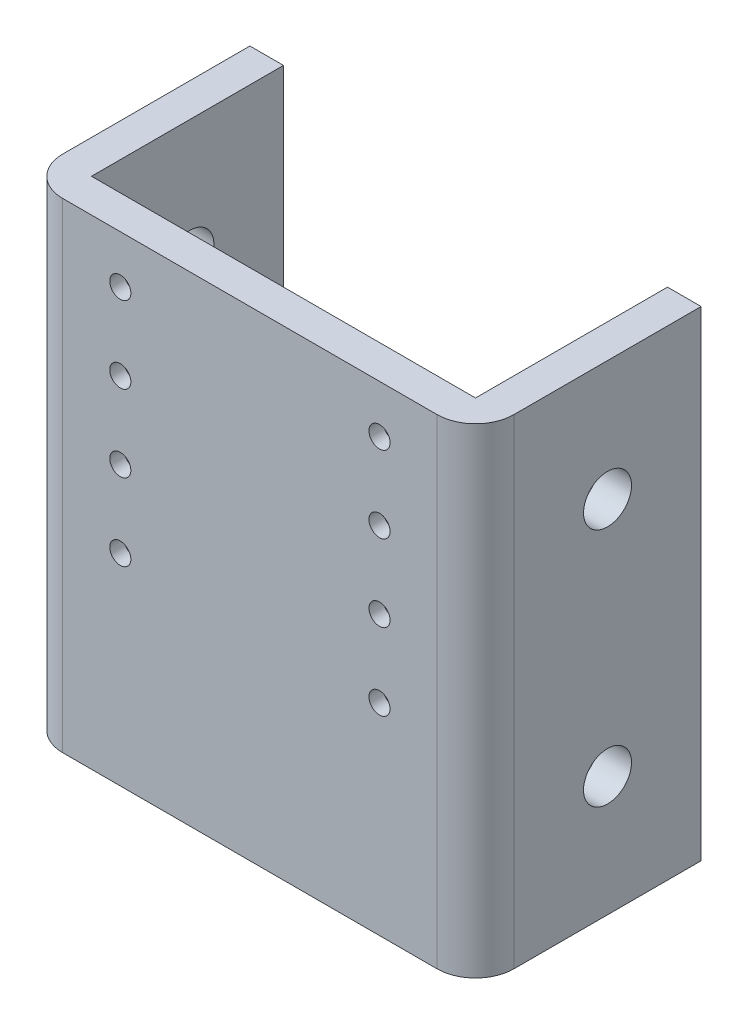
ISO-10303-21;
HEADER;
FILE_DESCRIPTION(('STEP AP214'),'2;1');
FILE_NAME('part.step','',(''),(''),'','','');
FILE_SCHEMA(('AUTOMOTIVE_DESIGN { 1 0 10303 214 1 1 1 1 }'));
ENDSEC;
DATA;
#1=APPLICATION_CONTEXT('core data for automotive mechanical design processes');
#2=APPLICATION_PROTOCOL_DEFINITION('international standard','automotive_design',2000,#1);
#3=PRODUCT_CONTEXT('',#1,'mechanical');
#4=PRODUCT('Part','Part','',(#3));
#5=PRODUCT_RELATED_PRODUCT_CATEGORY('part','',(#4));
#6=PRODUCT_DEFINITION_FORMATION('','',#4);
#7=PRODUCT_DEFINITION_CONTEXT('part definition',#1,'design');
#8=PRODUCT_DEFINITION('design','',#6,#7);
#9=PRODUCT_DEFINITION_SHAPE('','',#8);
#10=(LENGTH_UNIT() NAMED_UNIT(*) SI_UNIT(.MILLI.,.METRE.));
#11=(NAMED_UNIT(*) PLANE_ANGLE_UNIT() SI_UNIT($,.RADIAN.));
#12=(NAMED_UNIT(*) SI_UNIT($,.STERADIAN.) SOLID_ANGLE_UNIT());
#13=UNCERTAINTY_MEASURE_WITH_UNIT(LENGTH_MEASURE(1.E-05),#10,'distance_accuracy_value','');
#14=(GEOMETRIC_REPRESENTATION_CONTEXT(3) GLOBAL_UNCERTAINTY_ASSIGNED_CONTEXT((#13)) GLOBAL_UNIT_ASSIGNED_CONTEXT((#10,
#11,#12)) REPRESENTATION_CONTEXT('',''));
#15=CARTESIAN_POINT('',(0.,0.,0.));
#16=DIRECTION('',(0.,0.,1.));
#17=DIRECTION('',(1.,0.,0.));
#18=AXIS2_PLACEMENT_3D('',#15,#16,#17);
#19=CARTESIAN_POINT('',(-13.5,20.,-1.5));
#20=DIRECTION('',(0.,0.,1.));
#21=DIRECTION('',(1.,0.,0.));
#22=AXIS2_PLACEMENT_3D('',#19,#20,#21);
#23=CYLINDRICAL_SURFACE('',#22,1.1);
#24=CARTESIAN_POINT('',(-13.5,20.,3.5));
#25=DIRECTION('',(0.,0.,1.));
#26=DIRECTION('',(1.,0.,0.));
#27=AXIS2_PLACEMENT_3D('',#24,#25,#26);
#28=CIRCLE('',#27,1.1);
#29=CARTESIAN_POINT('',(-12.4,20.,3.5));
#30=VERTEX_POINT('',#29);
#31=EDGE_CURVE('E203',#30,#30,#28,.T.);
#32=ORIENTED_EDGE('',*,*,#31,.T.);
#33=EDGE_LOOP('',(#32));
#34=FACE_BOUND('',#33,.T.);
#35=CARTESIAN_POINT('',(-13.5,20.,2.));
#36=DIRECTION('',(0.,0.,-1.));
#37=DIRECTION('',(-1.,0.,0.));
#38=AXIS2_PLACEMENT_3D('',#35,#36,#37);
#39=CIRCLE('',#38,1.1);
#40=CARTESIAN_POINT('',(-14.6,20.,2.));
#41=VERTEX_POINT('',#40);
#42=EDGE_CURVE('E155',#41,#41,#39,.F.);
#43=ORIENTED_EDGE('',*,*,#42,.F.);
#44=EDGE_LOOP('',(#43));
#45=FACE_BOUND('',#44,.T.);
#46=ADVANCED_FACE('F41',(#34,#45),#23,.F.);
#47=CARTESIAN_POINT('',(13.5,20.,-1.5));
#48=DIRECTION('',(0.,0.,1.));
#49=DIRECTION('',(1.,0.,0.));
#50=AXIS2_PLACEMENT_3D('',#47,#48,#49);
#51=CYLINDRICAL_SURFACE('',#50,1.1);
#52=CARTESIAN_POINT('',(13.5,20.,3.5));
#53=DIRECTION('',(0.,0.,1.));
#54=DIRECTION('',(1.,0.,0.));
#55=AXIS2_PLACEMENT_3D('',#52,#53,#54);
#56=CIRCLE('',#55,1.1);
#57=CARTESIAN_POINT('',(14.6,20.,3.5));
#58=VERTEX_POINT('',#57);
#59=EDGE_CURVE('E199',#58,#58,#56,.T.);
#60=ORIENTED_EDGE('',*,*,#59,.T.);
#61=EDGE_LOOP('',(#60));
#62=FACE_BOUND('',#61,.T.);
#63=CARTESIAN_POINT('',(13.5,20.,2.));
#64=DIRECTION('',(0.,0.,-1.));
#65=DIRECTION('',(-1.,0.,0.));
#66=AXIS2_PLACEMENT_3D('',#63,#64,#65);
#67=CIRCLE('',#66,1.1);
#68=CARTESIAN_POINT('',(12.4,20.,2.));
#69=VERTEX_POINT('',#68);
#70=EDGE_CURVE('E289',#69,#69,#67,.F.);
#71=ORIENTED_EDGE('',*,*,#70,.F.);
#72=EDGE_LOOP('',(#71));
#73=FACE_BOUND('',#72,.T.);
#74=ADVANCED_FACE('F440',(#62,#73),#51,.F.);
#75=CARTESIAN_POINT('',(13.5000000000001,12.,-1.5));
#76=DIRECTION('',(0.,0.,1.));
#77=DIRECTION('',(1.,0.,0.));
#78=AXIS2_PLACEMENT_3D('',#75,#76,#77);
#79=CYLINDRICAL_SURFACE('',#78,1.1);
#80=CARTESIAN_POINT('',(13.5000000000001,12.,3.5));
#81=DIRECTION('',(0.,0.,1.));
#82=DIRECTION('',(1.,0.,0.));
#83=AXIS2_PLACEMENT_3D('',#80,#81,#82);
#84=CIRCLE('',#83,1.1);
#85=CARTESIAN_POINT('',(14.6000000000001,12.,3.5));
#86=VERTEX_POINT('',#85);
#87=EDGE_CURVE('E204',#86,#86,#84,.T.);
#88=ORIENTED_EDGE('',*,*,#87,.T.);
#89=EDGE_LOOP('',(#88));
#90=FACE_BOUND('',#89,.T.);
#91=CARTESIAN_POINT('',(13.5000000000001,12.,2.));
#92=DIRECTION('',(0.,0.,-1.));
#93=DIRECTION('',(-1.,0.,0.));
#94=AXIS2_PLACEMENT_3D('',#91,#92,#93);
#95=CIRCLE('',#94,1.1);
#96=CARTESIAN_POINT('',(12.4000000000001,12.,2.));
#97=VERTEX_POINT('',#96);
#98=EDGE_CURVE('E285',#97,#97,#95,.F.);
#99=ORIENTED_EDGE('',*,*,#98,.F.);
#100=EDGE_LOOP('',(#99));
#101=FACE_BOUND('',#100,.T.);
#102=ADVANCED_FACE('F446',(#90,#101),#79,.F.);
#103=CARTESIAN_POINT('',(13.5000000000002,4.,-1.5));
#104=DIRECTION('',(0.,0.,1.));
#105=DIRECTION('',(1.,0.,0.));
#106=AXIS2_PLACEMENT_3D('',#103,#104,#105);
#107=CYLINDRICAL_SURFACE('',#106,1.1);
#108=CARTESIAN_POINT('',(13.5000000000002,4.,3.5));
#109=DIRECTION('',(0.,0.,1.));
#110=DIRECTION('',(1.,0.,0.));
#111=AXIS2_PLACEMENT_3D('',#108,#109,#110);
#112=CIRCLE('',#111,1.1);
#113=CARTESIAN_POINT('',(14.6000000000002,4.,3.5));
#114=VERTEX_POINT('',#113);
#115=EDGE_CURVE('E208',#114,#114,#112,.T.);
#116=ORIENTED_EDGE('',*,*,#115,.T.);
#117=EDGE_LOOP('',(#116));
#118=FACE_BOUND('',#117,.T.);
#119=CARTESIAN_POINT('',(13.5000000000002,4.,2.));
#120=DIRECTION('',(0.,0.,-1.));
#121=DIRECTION('',(-1.,0.,0.));
#122=AXIS2_PLACEMENT_3D('',#119,#120,#121);
#123=CIRCLE('',#122,1.1);
#124=CARTESIAN_POINT('',(12.4000000000002,4.,2.));
#125=VERTEX_POINT('',#124);
#126=EDGE_CURVE('E281',#125,#125,#123,.F.);
#127=ORIENTED_EDGE('',*,*,#126,.F.);
#128=EDGE_LOOP('',(#127));
#129=FACE_BOUND('',#128,.T.);
#130=ADVANCED_FACE('F656',(#118,#129),#107,.F.);
#131=CARTESIAN_POINT('',(13.5000000000003,-4.,-1.5));
#132=DIRECTION('',(0.,0.,1.));
#133=DIRECTION('',(1.,0.,0.));
#134=AXIS2_PLACEMENT_3D('',#131,#132,#133);
#135=CYLINDRICAL_SURFACE('',#134,1.1);
#136=CARTESIAN_POINT('',(13.5000000000003,-4.,3.5));
#137=DIRECTION('',(0.,0.,1.));
#138=DIRECTION('',(1.,0.,0.));
#139=AXIS2_PLACEMENT_3D('',#136,#137,#138);
#140=CIRCLE('',#139,1.1);
#141=CARTESIAN_POINT('',(14.6000000000003,-4.,3.5));
#142=VERTEX_POINT('',#141);
#143=EDGE_CURVE('E212',#142,#142,#140,.T.);
#144=ORIENTED_EDGE('',*,*,#143,.T.);
#145=EDGE_LOOP('',(#144));
#146=FACE_BOUND('',#145,.T.);
#147=CARTESIAN_POINT('',(13.5000000000003,-4.,2.));
#148=DIRECTION('',(0.,0.,-1.));
#149=DIRECTION('',(-1.,0.,0.));
#150=AXIS2_PLACEMENT_3D('',#147,#148,#149);
#151=CIRCLE('',#150,1.1);
#152=CARTESIAN_POINT('',(12.4000000000002,-4.,2.));
#153=VERTEX_POINT('',#152);
#154=EDGE_CURVE('E277',#153,#153,#151,.F.);
#155=ORIENTED_EDGE('',*,*,#154,.F.);
#156=EDGE_LOOP('',(#155));
#157=FACE_BOUND('',#156,.T.);
#158=ADVANCED_FACE('F666',(#146,#157),#135,.F.);
#159=CARTESIAN_POINT('',(-13.4999999999999,12.,-1.5));
#160=DIRECTION('',(0.,0.,1.));
#161=DIRECTION('',(1.,0.,0.));
#162=AXIS2_PLACEMENT_3D('',#159,#160,#161);
#163=CYLINDRICAL_SURFACE('',#162,1.1);
#164=CARTESIAN_POINT('',(-13.4999999999999,12.,3.5));
#165=DIRECTION('',(0.,0.,1.));
#166=DIRECTION('',(1.,0.,0.));
#167=AXIS2_PLACEMENT_3D('',#164,#165,#166);
#168=CIRCLE('',#167,1.1);
#169=CARTESIAN_POINT('',(-12.3999999999999,12.,3.5));
#170=VERTEX_POINT('',#169);
#171=EDGE_CURVE('E216',#170,#170,#168,.T.);
#172=ORIENTED_EDGE('',*,*,#171,.T.);
#173=EDGE_LOOP('',(#172));
#174=FACE_BOUND('',#173,.T.);
#175=CARTESIAN_POINT('',(-13.4999999999999,12.,2.));
#176=DIRECTION('',(0.,0.,-1.));
#177=DIRECTION('',(-1.,0.,0.));
#178=AXIS2_PLACEMENT_3D('',#175,#176,#177);
#179=CIRCLE('',#178,1.1);
#180=CARTESIAN_POINT('',(-14.5999999999999,12.,2.));
#181=VERTEX_POINT('',#180);
#182=EDGE_CURVE('E273',#181,#181,#179,.F.);
#183=ORIENTED_EDGE('',*,*,#182,.F.);
#184=EDGE_LOOP('',(#183));
#185=FACE_BOUND('',#184,.T.);
#186=ADVANCED_FACE('F676',(#174,#185),#163,.F.);
#187=CARTESIAN_POINT('',(-13.4999999999998,4.,-1.5));
#188=DIRECTION('',(0.,0.,1.));
#189=DIRECTION('',(1.,0.,0.));
#190=AXIS2_PLACEMENT_3D('',#187,#188,#189);
#191=CYLINDRICAL_SURFACE('',#190,1.1);
#192=CARTESIAN_POINT('',(-13.4999999999998,4.,3.5));
#193=DIRECTION('',(0.,0.,1.));
#194=DIRECTION('',(1.,0.,0.));
#195=AXIS2_PLACEMENT_3D('',#192,#193,#194);
#196=CIRCLE('',#195,1.1);
#197=CARTESIAN_POINT('',(-12.3999999999998,4.,3.5));
#198=VERTEX_POINT('',#197);
#199=EDGE_CURVE('E220',#198,#198,#196,.T.);
#200=ORIENTED_EDGE('',*,*,#199,.T.);
#201=EDGE_LOOP('',(#200));
#202=FACE_BOUND('',#201,.T.);
#203=CARTESIAN_POINT('',(-13.4999999999998,4.,2.));
#204=DIRECTION('',(0.,0.,-1.));
#205=DIRECTION('',(-1.,0.,0.));
#206=AXIS2_PLACEMENT_3D('',#203,#204,#205);
#207=CIRCLE('',#206,1.1);
#208=CARTESIAN_POINT('',(-14.5999999999998,4.,2.));
#209=VERTEX_POINT('',#208);
#210=EDGE_CURVE('E268',#209,#209,#207,.F.);
#211=ORIENTED_EDGE('',*,*,#210,.F.);
#212=EDGE_LOOP('',(#211));
#213=FACE_BOUND('',#212,.T.);
#214=ADVANCED_FACE('F686',(#202,#213),#191,.F.);
#215=CARTESIAN_POINT('',(-13.4999999999997,-4.,-1.5));
#216=DIRECTION('',(0.,0.,1.));
#217=DIRECTION('',(1.,0.,0.));
#218=AXIS2_PLACEMENT_3D('',#215,#216,#217);
#219=CYLINDRICAL_SURFACE('',#218,1.1);
#220=CARTESIAN_POINT('',(-13.4999999999997,-4.,3.5));
#221=DIRECTION('',(0.,0.,1.));
#222=DIRECTION('',(1.,0.,0.));
#223=AXIS2_PLACEMENT_3D('',#220,#221,#222);
#224=CIRCLE('',#223,1.1);
#225=CARTESIAN_POINT('',(-12.3999999999997,-4.,3.5));
#226=VERTEX_POINT('',#225);
#227=EDGE_CURVE('E192',#226,#226,#224,.T.);
#228=ORIENTED_EDGE('',*,*,#227,.T.);
#229=EDGE_LOOP('',(#228));
#230=FACE_BOUND('',#229,.T.);
#231=CARTESIAN_POINT('',(-13.4999999999997,-4.,2.));
#232=DIRECTION('',(0.,0.,-1.));
#233=DIRECTION('',(-1.,0.,0.));
#234=AXIS2_PLACEMENT_3D('',#231,#232,#233);
#235=CIRCLE('',#234,1.1);
#236=CARTESIAN_POINT('',(-14.5999999999998,-4.,2.));
#237=VERTEX_POINT('',#236);
#238=EDGE_CURVE('E264',#237,#237,#235,.F.);
#239=ORIENTED_EDGE('',*,*,#238,.F.);
#240=EDGE_LOOP('',(#239));
#241=FACE_BOUND('',#240,.T.);
#242=ADVANCED_FACE('F452',(#230,#241),#219,.F.);
#243=CARTESIAN_POINT('',(-18.,25.,3.5));
#244=DIRECTION('',(0.,-1.,0.));
#245=DIRECTION('',(0.,0.,-1.));
#246=AXIS2_PLACEMENT_3D('',#243,#244,#245);
#247=PLANE('',#246);
#248=DIRECTION('',(0.,0.,1.));
#249=VECTOR('',#248,1.);
#250=CARTESIAN_POINT('',(-23.5,25.,0.));
#251=LINE('',#250,#249);
#252=CARTESIAN_POINT('',(-23.5,25.,-20.));
#253=VERTEX_POINT('',#252);
#254=CARTESIAN_POINT('',(-23.5,25.,-0.5));
#255=VERTEX_POINT('',#254);
#256=EDGE_CURVE('E162',#253,#255,#251,.T.);
#257=ORIENTED_EDGE('',*,*,#256,.T.);
#258=CARTESIAN_POINT('',(-19.5,25.,-0.5));
#259=DIRECTION('',(0.,-1.,0.));
#260=DIRECTION('',(0.,0.,-1.));
#261=AXIS2_PLACEMENT_3D('',#258,#259,#260);
#262=CIRCLE('',#261,4.);
#263=CARTESIAN_POINT('',(-19.5,25.,3.5));
#264=VERTEX_POINT('',#263);
#265=EDGE_CURVE('E250',#255,#264,#262,.F.);
#266=ORIENTED_EDGE('',*,*,#265,.T.);
#267=DIRECTION('',(-1.,0.,0.));
#268=VECTOR('',#267,1.);
#269=CARTESIAN_POINT('',(-18.,25.,3.5));
#270=LINE('',#269,#268);
#271=CARTESIAN_POINT('',(19.5,25.,3.5));
#272=VERTEX_POINT('',#271);
#273=EDGE_CURVE('E231',#272,#264,#270,.T.);
#274=ORIENTED_EDGE('',*,*,#273,.F.);
#275=CARTESIAN_POINT('',(19.5,25.,-0.5));
#276=DIRECTION('',(0.,-1.,0.));
#277=DIRECTION('',(0.,0.,-1.));
#278=AXIS2_PLACEMENT_3D('',#275,#276,#277);
#279=CIRCLE('',#278,4.);
#280=CARTESIAN_POINT('',(23.5,25.,-0.5));
#281=VERTEX_POINT('',#280);
#282=EDGE_CURVE('E247',#272,#281,#279,.F.);
#283=ORIENTED_EDGE('',*,*,#282,.T.);
#284=DIRECTION('',(0.,0.,1.));
#285=VECTOR('',#284,1.);
#286=CARTESIAN_POINT('',(23.5,25.,0.));
#287=LINE('',#286,#285);
#288=CARTESIAN_POINT('',(23.5,25.,-20.));
#289=VERTEX_POINT('',#288);
#290=EDGE_CURVE('E152',#289,#281,#287,.T.);
#291=ORIENTED_EDGE('',*,*,#290,.F.);
#292=DIRECTION('',(1.,0.,0.));
#293=VECTOR('',#292,1.);
#294=CARTESIAN_POINT('',(0.,25.,-20.));
#295=LINE('',#294,#293);
#296=CARTESIAN_POINT('',(20.,25.,-20.));
#297=VERTEX_POINT('',#296);
#298=EDGE_CURVE('E135',#297,#289,#295,.T.);
#299=ORIENTED_EDGE('',*,*,#298,.F.);
#300=DIRECTION('',(0.,0.,-1.));
#301=VECTOR('',#300,1.);
#302=CARTESIAN_POINT('',(20.,25.,0.));
#303=LINE('',#302,#301);
#304=CARTESIAN_POINT('',(20.,25.,0.));
#305=VERTEX_POINT('',#304);
#306=EDGE_CURVE('E142',#305,#297,#303,.T.);
#307=ORIENTED_EDGE('',*,*,#306,.F.);
#308=DIRECTION('',(-1.,0.,0.));
#309=VECTOR('',#308,1.);
#310=CARTESIAN_POINT('',(-18.,25.,0.));
#311=LINE('',#310,#309);
#312=CARTESIAN_POINT('',(-20.,25.,0.));
#313=VERTEX_POINT('',#312);
#314=EDGE_CURVE('E230',#305,#313,#311,.T.);
#315=ORIENTED_EDGE('',*,*,#314,.T.);
#316=DIRECTION('',(0.,0.,-1.));
#317=VECTOR('',#316,1.);
#318=CARTESIAN_POINT('',(-20.,25.,0.));
#319=LINE('',#318,#317);
#320=CARTESIAN_POINT('',(-20.,25.,-20.));
#321=VERTEX_POINT('',#320);
#322=EDGE_CURVE('E182',#313,#321,#319,.T.);
#323=ORIENTED_EDGE('',*,*,#322,.T.);
#324=DIRECTION('',(-1.,0.,0.));
#325=VECTOR('',#324,1.);
#326=CARTESIAN_POINT('',(0.,25.,-20.));
#327=LINE('',#326,#325);
#328=EDGE_CURVE('E170',#321,#253,#327,.T.);
#329=ORIENTED_EDGE('',*,*,#328,.T.);
#330=EDGE_LOOP('',(#257,#266,#274,#283,#291,#299,#307,#315,#323,#329));
#331=FACE_BOUND('',#330,.T.);
#332=ADVANCED_FACE('F406',(#331),#247,.F.);
#333=CARTESIAN_POINT('',(-18.,-25.,3.5));
#334=DIRECTION('',(0.,1.,0.));
#335=DIRECTION('',(0.,0.,1.));
#336=AXIS2_PLACEMENT_3D('',#333,#334,#335);
#337=PLANE('',#336);
#338=DIRECTION('',(1.,0.,0.));
#339=VECTOR('',#338,1.);
#340=CARTESIAN_POINT('',(-18.,-25.,3.5));
#341=LINE('',#340,#339);
#342=CARTESIAN_POINT('',(-19.5,-25.,3.5));
#343=VERTEX_POINT('',#342);
#344=CARTESIAN_POINT('',(19.5,-25.,3.5));
#345=VERTEX_POINT('',#344);
#346=EDGE_CURVE('E235',#343,#345,#341,.T.);
#347=ORIENTED_EDGE('',*,*,#346,.F.);
#348=CARTESIAN_POINT('',(-19.5,-25.,-0.5));
#349=DIRECTION('',(0.,1.,0.));
#350=DIRECTION('',(0.,0.,1.));
#351=AXIS2_PLACEMENT_3D('',#348,#349,#350);
#352=CIRCLE('',#351,4.);
#353=CARTESIAN_POINT('',(-23.5,-25.,-0.5));
#354=VERTEX_POINT('',#353);
#355=EDGE_CURVE('E51',#343,#354,#352,.F.);
#356=ORIENTED_EDGE('',*,*,#355,.T.);
#357=DIRECTION('',(0.,0.,1.));
#358=VECTOR('',#357,1.);
#359=CARTESIAN_POINT('',(-23.5,-25.,0.));
#360=LINE('',#359,#358);
#361=CARTESIAN_POINT('',(-23.5,-25.,-20.));
#362=VERTEX_POINT('',#361);
#363=EDGE_CURVE('E165',#362,#354,#360,.T.);
#364=ORIENTED_EDGE('',*,*,#363,.F.);
#365=DIRECTION('',(-1.,0.,0.));
#366=VECTOR('',#365,1.);
#367=CARTESIAN_POINT('',(0.,-25.,-20.));
#368=LINE('',#367,#366);
#369=CARTESIAN_POINT('',(-20.,-25.,-20.));
#370=VERTEX_POINT('',#369);
#371=EDGE_CURVE('E174',#370,#362,#368,.T.);
#372=ORIENTED_EDGE('',*,*,#371,.F.);
#373=DIRECTION('',(0.,0.,-1.));
#374=VECTOR('',#373,1.);
#375=CARTESIAN_POINT('',(-20.,-25.,0.));
#376=LINE('',#375,#374);
#377=CARTESIAN_POINT('',(-20.,-25.,0.));
#378=VERTEX_POINT('',#377);
#379=EDGE_CURVE('E169',#378,#370,#376,.T.);
#380=ORIENTED_EDGE('',*,*,#379,.F.);
#381=DIRECTION('',(1.,0.,0.));
#382=VECTOR('',#381,1.);
#383=CARTESIAN_POINT('',(-18.,-25.,0.));
#384=LINE('',#383,#382);
#385=CARTESIAN_POINT('',(20.,-25.,0.));
#386=VERTEX_POINT('',#385);
#387=EDGE_CURVE('E236',#378,#386,#384,.T.);
#388=ORIENTED_EDGE('',*,*,#387,.T.);
#389=DIRECTION('',(0.,0.,-1.));
#390=VECTOR('',#389,1.);
#391=CARTESIAN_POINT('',(20.,-25.,0.));
#392=LINE('',#391,#390);
#393=CARTESIAN_POINT('',(20.,-25.,-20.));
#394=VERTEX_POINT('',#393);
#395=EDGE_CURVE('E125',#386,#394,#392,.T.);
#396=ORIENTED_EDGE('',*,*,#395,.T.);
#397=DIRECTION('',(1.,0.,0.));
#398=VECTOR('',#397,1.);
#399=CARTESIAN_POINT('',(0.,-25.,-20.));
#400=LINE('',#399,#398);
#401=CARTESIAN_POINT('',(23.5,-25.,-20.));
#402=VERTEX_POINT('',#401);
#403=EDGE_CURVE('E120',#394,#402,#400,.T.);
#404=ORIENTED_EDGE('',*,*,#403,.T.);
#405=DIRECTION('',(0.,0.,1.));
#406=VECTOR('',#405,1.);
#407=CARTESIAN_POINT('',(23.5,-25.,0.));
#408=LINE('',#407,#406);
#409=CARTESIAN_POINT('',(23.5,-25.,-0.5));
#410=VERTEX_POINT('',#409);
#411=EDGE_CURVE('E123',#402,#410,#408,.T.);
#412=ORIENTED_EDGE('',*,*,#411,.T.);
#413=CARTESIAN_POINT('',(19.5,-25.,-0.5));
#414=DIRECTION('',(0.,1.,0.));
#415=DIRECTION('',(0.,0.,1.));
#416=AXIS2_PLACEMENT_3D('',#413,#414,#415);
#417=CIRCLE('',#416,4.);
#418=EDGE_CURVE('E64',#410,#345,#417,.F.);
#419=ORIENTED_EDGE('',*,*,#418,.T.);
#420=EDGE_LOOP('',(#347,#356,#364,#372,#380,#388,#396,#404,#412,#419));
#421=FACE_BOUND('',#420,.T.);
#422=ADVANCED_FACE('F122',(#421),#337,.F.);
#423=CARTESIAN_POINT('',(0.,0.,3.5));
#424=DIRECTION('',(0.,0.,-1.));
#425=DIRECTION('',(-1.,0.,0.));
#426=AXIS2_PLACEMENT_3D('',#423,#424,#425);
#427=PLANE('',#426);
#428=ORIENTED_EDGE('',*,*,#227,.F.);
#429=EDGE_LOOP('',(#428));
#430=FACE_BOUND('',#429,.T.);
#431=ORIENTED_EDGE('',*,*,#199,.F.);
#432=EDGE_LOOP('',(#431));
#433=FACE_BOUND('',#432,.T.);
#434=ORIENTED_EDGE('',*,*,#171,.F.);
#435=EDGE_LOOP('',(#434));
#436=FACE_BOUND('',#435,.T.);
#437=ORIENTED_EDGE('',*,*,#143,.F.);
#438=EDGE_LOOP('',(#437));
#439=FACE_BOUND('',#438,.T.);
#440=ORIENTED_EDGE('',*,*,#115,.F.);
#441=EDGE_LOOP('',(#440));
#442=FACE_BOUND('',#441,.T.);
#443=ORIENTED_EDGE('',*,*,#87,.F.);
#444=EDGE_LOOP('',(#443));
#445=FACE_BOUND('',#444,.T.);
#446=ORIENTED_EDGE('',*,*,#59,.F.);
#447=EDGE_LOOP('',(#446));
#448=FACE_BOUND('',#447,.T.);
#449=ORIENTED_EDGE('',*,*,#31,.F.);
#450=EDGE_LOOP('',(#449));
#451=FACE_BOUND('',#450,.T.);
#452=ORIENTED_EDGE('',*,*,#273,.T.);
#453=DIRECTION('',(0.,1.,0.));
#454=VECTOR('',#453,1.);
#455=CARTESIAN_POINT('',(-19.5,-25.,3.5));
#456=LINE('',#455,#454);
#457=EDGE_CURVE('E257',#264,#343,#456,.F.);
#458=ORIENTED_EDGE('',*,*,#457,.T.);
#459=ORIENTED_EDGE('',*,*,#346,.T.);
#460=DIRECTION('',(0.,1.,0.));
#461=VECTOR('',#460,1.);
#462=CARTESIAN_POINT('',(19.5,0.,3.5));
#463=LINE('',#462,#461);
#464=EDGE_CURVE('E253',#345,#272,#463,.T.);
#465=ORIENTED_EDGE('',*,*,#464,.T.);
#466=EDGE_LOOP('',(#452,#458,#459,#465));
#467=FACE_BOUND('',#466,.T.);
#468=ADVANCED_FACE('F396',(#430,#433,#436,#439,#442,#445,#448,#451,#467),#427,.F.);
#469=CARTESIAN_POINT('',(0.,0.,0.));
#470=DIRECTION('',(0.,0.,-1.));
#471=DIRECTION('',(-1.,0.,0.));
#472=AXIS2_PLACEMENT_3D('',#469,#470,#471);
#473=PLANE('',#472);
#474=CARTESIAN_POINT('',(13.4999999999997,-4.,0.));
#475=DIRECTION('',(0.,0.,-1.));
#476=DIRECTION('',(-1.,0.,0.));
#477=AXIS2_PLACEMENT_3D('',#474,#475,#476);
#478=CIRCLE('',#477,2.25);
#479=CARTESIAN_POINT('',(11.2499999999997,-4.,0.));
#480=VERTEX_POINT('',#479);
#481=EDGE_CURVE('E327',#480,#480,#478,.T.);
#482=ORIENTED_EDGE('',*,*,#481,.F.);
#483=EDGE_LOOP('',(#482));
#484=FACE_BOUND('',#483,.T.);
#485=CARTESIAN_POINT('',(13.4999999999998,4.,0.));
#486=DIRECTION('',(0.,0.,-1.));
#487=DIRECTION('',(-1.,0.,0.));
#488=AXIS2_PLACEMENT_3D('',#485,#486,#487);
#489=CIRCLE('',#488,2.25);
#490=CARTESIAN_POINT('',(11.2499999999998,4.,0.));
#491=VERTEX_POINT('',#490);
#492=EDGE_CURVE('E372',#491,#491,#489,.T.);
#493=ORIENTED_EDGE('',*,*,#492,.F.);
#494=EDGE_LOOP('',(#493));
#495=FACE_BOUND('',#494,.T.);
#496=CARTESIAN_POINT('',(13.4999999999999,12.,0.));
#497=DIRECTION('',(0.,0.,-1.));
#498=DIRECTION('',(-1.,0.,0.));
#499=AXIS2_PLACEMENT_3D('',#496,#497,#498);
#500=CIRCLE('',#499,2.25);
#501=CARTESIAN_POINT('',(11.2499999999999,12.,0.));
#502=VERTEX_POINT('',#501);
#503=EDGE_CURVE('E364',#502,#502,#500,.T.);
#504=ORIENTED_EDGE('',*,*,#503,.F.);
#505=EDGE_LOOP('',(#504));
#506=FACE_BOUND('',#505,.T.);
#507=CARTESIAN_POINT('',(-13.5000000000003,-4.,0.));
#508=DIRECTION('',(0.,0.,-1.));
#509=DIRECTION('',(-1.,0.,0.));
#510=AXIS2_PLACEMENT_3D('',#507,#508,#509);
#511=CIRCLE('',#510,2.25);
#512=CARTESIAN_POINT('',(-15.7500000000003,-4.,0.));
#513=VERTEX_POINT('',#512);
#514=EDGE_CURVE('E356',#513,#513,#511,.T.);
#515=ORIENTED_EDGE('',*,*,#514,.F.);
#516=EDGE_LOOP('',(#515));
#517=FACE_BOUND('',#516,.T.);
#518=CARTESIAN_POINT('',(-13.5000000000002,4.,0.));
#519=DIRECTION('',(0.,0.,-1.));
#520=DIRECTION('',(-1.,0.,0.));
#521=AXIS2_PLACEMENT_3D('',#518,#519,#520);
#522=CIRCLE('',#521,2.25);
#523=CARTESIAN_POINT('',(-15.7500000000002,4.,0.));
#524=VERTEX_POINT('',#523);
#525=EDGE_CURVE('E348',#524,#524,#522,.T.);
#526=ORIENTED_EDGE('',*,*,#525,.F.);
#527=EDGE_LOOP('',(#526));
#528=FACE_BOUND('',#527,.T.);
#529=CARTESIAN_POINT('',(-13.5000000000001,12.,0.));
#530=DIRECTION('',(0.,0.,-1.));
#531=DIRECTION('',(-1.,0.,0.));
#532=AXIS2_PLACEMENT_3D('',#529,#530,#531);
#533=CIRCLE('',#532,2.25);
#534=CARTESIAN_POINT('',(-15.7500000000001,12.,0.));
#535=VERTEX_POINT('',#534);
#536=EDGE_CURVE('E340',#535,#535,#533,.T.);
#537=ORIENTED_EDGE('',*,*,#536,.F.);
#538=EDGE_LOOP('',(#537));
#539=FACE_BOUND('',#538,.T.);
#540=CARTESIAN_POINT('',(-13.5,20.,0.));
#541=DIRECTION('',(0.,0.,-1.));
#542=DIRECTION('',(-1.,0.,0.));
#543=AXIS2_PLACEMENT_3D('',#540,#541,#542);
#544=CIRCLE('',#543,2.25);
#545=CARTESIAN_POINT('',(-15.75,20.,0.));
#546=VERTEX_POINT('',#545);
#547=EDGE_CURVE('E332',#546,#546,#544,.T.);
#548=ORIENTED_EDGE('',*,*,#547,.F.);
#549=EDGE_LOOP('',(#548));
#550=FACE_BOUND('',#549,.T.);
#551=CARTESIAN_POINT('',(13.5,20.,0.));
#552=DIRECTION('',(0.,0.,-1.));
#553=DIRECTION('',(-1.,0.,0.));
#554=AXIS2_PLACEMENT_3D('',#551,#552,#553);
#555=CIRCLE('',#554,2.25);
#556=CARTESIAN_POINT('',(11.25,20.,0.));
#557=VERTEX_POINT('',#556);
#558=EDGE_CURVE('E147',#557,#557,#555,.T.);
#559=ORIENTED_EDGE('',*,*,#558,.F.);
#560=EDGE_LOOP('',(#559));
#561=FACE_BOUND('',#560,.T.);
#562=ORIENTED_EDGE('',*,*,#314,.F.);
#563=DIRECTION('',(0.,1.,0.));
#564=VECTOR('',#563,1.);
#565=CARTESIAN_POINT('',(20.,-25.,0.));
#566=LINE('',#565,#564);
#567=EDGE_CURVE('E158',#386,#305,#566,.T.);
#568=ORIENTED_EDGE('',*,*,#567,.F.);
#569=ORIENTED_EDGE('',*,*,#387,.F.);
#570=DIRECTION('',(0.,1.,0.));
#571=VECTOR('',#570,1.);
#572=CARTESIAN_POINT('',(-20.,-25.,0.));
#573=LINE('',#572,#571);
#574=EDGE_CURVE('E178',#378,#313,#573,.T.);
#575=ORIENTED_EDGE('',*,*,#574,.T.);
#576=EDGE_LOOP('',(#562,#568,#569,#575));
#577=FACE_BOUND('',#576,.T.);
#578=ADVANCED_FACE('F392',(#484,#495,#506,#517,#528,#539,#550,#561,#577),#473,.T.);
#579=CARTESIAN_POINT('',(-23.5,-25.,0.));
#580=DIRECTION('',(-1.,0.,0.));
#581=DIRECTION('',(0.,0.,1.));
#582=AXIS2_PLACEMENT_3D('',#579,#580,#581);
#583=PLANE('',#582);
#584=CARTESIAN_POINT('',(-23.5,12.5,-10.25));
#585=DIRECTION('',(1.,0.,0.));
#586=DIRECTION('',(0.,0.,-1.));
#587=AXIS2_PLACEMENT_3D('',#584,#585,#586);
#588=CIRCLE('',#587,2.5);
#589=CARTESIAN_POINT('',(-23.5,12.5,-12.75));
#590=VERTEX_POINT('',#589);
#591=EDGE_CURVE('E299',#590,#590,#588,.T.);
#592=ORIENTED_EDGE('',*,*,#591,.T.);
#593=EDGE_LOOP('',(#592));
#594=FACE_BOUND('',#593,.T.);
#595=CARTESIAN_POINT('',(-23.5,-12.5,-10.25));
#596=DIRECTION('',(1.,0.,0.));
#597=DIRECTION('',(0.,0.,1.));
#598=AXIS2_PLACEMENT_3D('',#595,#596,#597);
#599=CIRCLE('',#598,2.5);
#600=CARTESIAN_POINT('',(-23.5,-12.5,-7.75));
#601=VERTEX_POINT('',#600);
#602=EDGE_CURVE('E313',#601,#601,#599,.T.);
#603=ORIENTED_EDGE('',*,*,#602,.T.);
#604=EDGE_LOOP('',(#603));
#605=FACE_BOUND('',#604,.T.);
#606=ORIENTED_EDGE('',*,*,#363,.T.);
#607=DIRECTION('',(0.,1.,0.));
#608=VECTOR('',#607,1.);
#609=CARTESIAN_POINT('',(-23.5,25.,-0.5));
#610=LINE('',#609,#608);
#611=EDGE_CURVE('E239',#354,#255,#610,.T.);
#612=ORIENTED_EDGE('',*,*,#611,.T.);
#613=ORIENTED_EDGE('',*,*,#256,.F.);
#614=DIRECTION('',(0.,1.,0.));
#615=VECTOR('',#614,1.);
#616=CARTESIAN_POINT('',(-23.5,-25.,-20.));
#617=LINE('',#616,#615);
#618=EDGE_CURVE('E189',#362,#253,#617,.T.);
#619=ORIENTED_EDGE('',*,*,#618,.F.);
#620=EDGE_LOOP('',(#606,#612,#613,#619));
#621=FACE_BOUND('',#620,.T.);
#622=ADVANCED_FACE('F395',(#594,#605,#621),#583,.T.);
#623=CARTESIAN_POINT('',(0.,-25.,-20.));
#624=DIRECTION('',(0.,0.,-1.));
#625=DIRECTION('',(-1.,0.,0.));
#626=AXIS2_PLACEMENT_3D('',#623,#624,#625);
#627=PLANE('',#626);
#628=ORIENTED_EDGE('',*,*,#328,.F.);
#629=DIRECTION('',(0.,1.,0.));
#630=VECTOR('',#629,1.);
#631=CARTESIAN_POINT('',(-20.,-25.,-20.));
#632=LINE('',#631,#630);
#633=EDGE_CURVE('E193',#370,#321,#632,.T.);
#634=ORIENTED_EDGE('',*,*,#633,.F.);
#635=ORIENTED_EDGE('',*,*,#371,.T.);
#636=ORIENTED_EDGE('',*,*,#618,.T.);
#637=EDGE_LOOP('',(#628,#634,#635,#636));
#638=FACE_BOUND('',#637,.T.);
#639=ADVANCED_FACE('F423',(#638),#627,.T.);
#640=CARTESIAN_POINT('',(-20.,-25.,0.));
#641=DIRECTION('',(1.,0.,0.));
#642=DIRECTION('',(0.,0.,-1.));
#643=AXIS2_PLACEMENT_3D('',#640,#641,#642);
#644=PLANE('',#643);
#645=CARTESIAN_POINT('',(-20.,12.5,-10.25));
#646=DIRECTION('',(1.,0.,0.));
#647=DIRECTION('',(0.,0.,-1.));
#648=AXIS2_PLACEMENT_3D('',#645,#646,#647);
#649=CIRCLE('',#648,2.5);
#650=CARTESIAN_POINT('',(-20.,12.5,-12.75));
#651=VERTEX_POINT('',#650);
#652=EDGE_CURVE('E323',#651,#651,#649,.T.);
#653=ORIENTED_EDGE('',*,*,#652,.F.);
#654=EDGE_LOOP('',(#653));
#655=FACE_BOUND('',#654,.T.);
#656=CARTESIAN_POINT('',(-20.,-12.5,-10.25));
#657=DIRECTION('',(1.,0.,0.));
#658=DIRECTION('',(0.,0.,-1.));
#659=AXIS2_PLACEMENT_3D('',#656,#657,#658);
#660=CIRCLE('',#659,2.5);
#661=CARTESIAN_POINT('',(-20.,-12.5,-12.75));
#662=VERTEX_POINT('',#661);
#663=EDGE_CURVE('E298',#662,#662,#660,.T.);
#664=ORIENTED_EDGE('',*,*,#663,.F.);
#665=EDGE_LOOP('',(#664));
#666=FACE_BOUND('',#665,.T.);
#667=ORIENTED_EDGE('',*,*,#322,.F.);
#668=ORIENTED_EDGE('',*,*,#574,.F.);
#669=ORIENTED_EDGE('',*,*,#379,.T.);
#670=ORIENTED_EDGE('',*,*,#633,.T.);
#671=EDGE_LOOP('',(#667,#668,#669,#670));
#672=FACE_BOUND('',#671,.T.);
#673=ADVANCED_FACE('F425',(#655,#666,#672),#644,.T.);
#674=CARTESIAN_POINT('',(23.5,-25.,0.));
#675=DIRECTION('',(-1.,0.,0.));
#676=DIRECTION('',(0.,0.,1.));
#677=AXIS2_PLACEMENT_3D('',#674,#675,#676);
#678=PLANE('',#677);
#679=CARTESIAN_POINT('',(23.5,12.5,-10.25));
#680=DIRECTION('',(1.,0.,0.));
#681=DIRECTION('',(0.,0.,-1.));
#682=AXIS2_PLACEMENT_3D('',#679,#680,#681);
#683=CIRCLE('',#682,2.5);
#684=CARTESIAN_POINT('',(23.5,12.5,-12.75));
#685=VERTEX_POINT('',#684);
#686=EDGE_CURVE('E307',#685,#685,#683,.T.);
#687=ORIENTED_EDGE('',*,*,#686,.F.);
#688=EDGE_LOOP('',(#687));
#689=FACE_BOUND('',#688,.T.);
#690=CARTESIAN_POINT('',(23.5,-12.5,-10.25));
#691=DIRECTION('',(1.,0.,0.));
#692=DIRECTION('',(0.,0.,1.));
#693=AXIS2_PLACEMENT_3D('',#690,#691,#692);
#694=CIRCLE('',#693,2.5);
#695=CARTESIAN_POINT('',(23.5,-12.5,-7.75));
#696=VERTEX_POINT('',#695);
#697=EDGE_CURVE('E319',#696,#696,#694,.T.);
#698=ORIENTED_EDGE('',*,*,#697,.F.);
#699=EDGE_LOOP('',(#698));
#700=FACE_BOUND('',#699,.T.);
#701=ORIENTED_EDGE('',*,*,#290,.T.);
#702=DIRECTION('',(0.,1.,0.));
#703=VECTOR('',#702,1.);
#704=CARTESIAN_POINT('',(23.5,-25.,-0.5));
#705=LINE('',#704,#703);
#706=EDGE_CURVE('E11',#281,#410,#705,.F.);
#707=ORIENTED_EDGE('',*,*,#706,.T.);
#708=ORIENTED_EDGE('',*,*,#411,.F.);
#709=DIRECTION('',(0.,1.,0.));
#710=VECTOR('',#709,1.);
#711=CARTESIAN_POINT('',(23.5,-25.,-20.));
#712=LINE('',#711,#710);
#713=EDGE_CURVE('E132',#402,#289,#712,.T.);
#714=ORIENTED_EDGE('',*,*,#713,.T.);
#715=EDGE_LOOP('',(#701,#707,#708,#714));
#716=FACE_BOUND('',#715,.T.);
#717=ADVANCED_FACE('F140',(#689,#700,#716),#678,.F.);
#718=CARTESIAN_POINT('',(20.,-25.,0.));
#719=DIRECTION('',(1.,0.,0.));
#720=DIRECTION('',(0.,0.,-1.));
#721=AXIS2_PLACEMENT_3D('',#718,#719,#720);
#722=PLANE('',#721);
#723=CARTESIAN_POINT('',(20.,12.5,-10.25));
#724=DIRECTION('',(1.,0.,0.));
#725=DIRECTION('',(0.,0.,-1.));
#726=AXIS2_PLACEMENT_3D('',#723,#724,#725);
#727=CIRCLE('',#726,2.5);
#728=CARTESIAN_POINT('',(20.,12.5,-12.75));
#729=VERTEX_POINT('',#728);
#730=EDGE_CURVE('E45',#729,#729,#727,.T.);
#731=ORIENTED_EDGE('',*,*,#730,.T.);
#732=EDGE_LOOP('',(#731));
#733=FACE_BOUND('',#732,.T.);
#734=CARTESIAN_POINT('',(20.,-12.5,-10.25));
#735=DIRECTION('',(1.,0.,0.));
#736=DIRECTION('',(0.,0.,-1.));
#737=AXIS2_PLACEMENT_3D('',#734,#735,#736);
#738=CIRCLE('',#737,2.5);
#739=CARTESIAN_POINT('',(20.,-12.5,-12.75));
#740=VERTEX_POINT('',#739);
#741=EDGE_CURVE('E295',#740,#740,#738,.T.);
#742=ORIENTED_EDGE('',*,*,#741,.T.);
#743=EDGE_LOOP('',(#742));
#744=FACE_BOUND('',#743,.T.);
#745=ORIENTED_EDGE('',*,*,#306,.T.);
#746=DIRECTION('',(0.,1.,0.));
#747=VECTOR('',#746,1.);
#748=CARTESIAN_POINT('',(20.,-25.,-20.));
#749=LINE('',#748,#747);
#750=EDGE_CURVE('E138',#394,#297,#749,.T.);
#751=ORIENTED_EDGE('',*,*,#750,.F.);
#752=ORIENTED_EDGE('',*,*,#395,.F.);
#753=ORIENTED_EDGE('',*,*,#567,.T.);
#754=EDGE_LOOP('',(#745,#751,#752,#753));
#755=FACE_BOUND('',#754,.T.);
#756=ADVANCED_FACE('F405',(#733,#744,#755),#722,.F.);
#757=CARTESIAN_POINT('',(0.,-25.,-20.));
#758=DIRECTION('',(0.,0.,1.));
#759=DIRECTION('',(1.,0.,0.));
#760=AXIS2_PLACEMENT_3D('',#757,#758,#759);
#761=PLANE('',#760);
#762=ORIENTED_EDGE('',*,*,#298,.T.);
#763=ORIENTED_EDGE('',*,*,#713,.F.);
#764=ORIENTED_EDGE('',*,*,#403,.F.);
#765=ORIENTED_EDGE('',*,*,#750,.T.);
#766=EDGE_LOOP('',(#762,#763,#764,#765));
#767=FACE_BOUND('',#766,.T.);
#768=ADVANCED_FACE('F133',(#767),#761,.F.);
#769=CARTESIAN_POINT('',(-19.5,-25.,-0.5));
#770=DIRECTION('',(0.,-1.,0.));
#771=DIRECTION('',(0.,0.,-1.));
#772=AXIS2_PLACEMENT_3D('',#769,#770,#771);
#773=CYLINDRICAL_SURFACE('',#772,4.);
#774=ORIENTED_EDGE('',*,*,#355,.F.);
#775=ORIENTED_EDGE('',*,*,#457,.F.);
#776=ORIENTED_EDGE('',*,*,#265,.F.);
#777=ORIENTED_EDGE('',*,*,#611,.F.);
#778=EDGE_LOOP('',(#774,#775,#776,#777));
#779=FACE_BOUND('',#778,.T.);
#780=ADVANCED_FACE('F416',(#779),#773,.T.);
#781=CARTESIAN_POINT('',(19.5,0.,-0.5));
#782=DIRECTION('',(0.,1.,0.));
#783=DIRECTION('',(0.,0.,1.));
#784=AXIS2_PLACEMENT_3D('',#781,#782,#783);
#785=CYLINDRICAL_SURFACE('',#784,4.);
#786=ORIENTED_EDGE('',*,*,#418,.F.);
#787=ORIENTED_EDGE('',*,*,#706,.F.);
#788=ORIENTED_EDGE('',*,*,#282,.F.);
#789=ORIENTED_EDGE('',*,*,#464,.F.);
#790=EDGE_LOOP('',(#786,#787,#788,#789));
#791=FACE_BOUND('',#790,.T.);
#792=ADVANCED_FACE('F43',(#791),#785,.T.);
#793=CARTESIAN_POINT('',(-13.5000000000003,-4.,2.));
#794=DIRECTION('',(0.,0.,-1.));
#795=DIRECTION('',(-1.,0.,0.));
#796=AXIS2_PLACEMENT_3D('',#793,#794,#795);
#797=PLANE('',#796);
#798=CARTESIAN_POINT('',(-13.5000000000003,-4.,2.));
#799=DIRECTION('',(0.,0.,-1.));
#800=DIRECTION('',(-1.,0.,0.));
#801=AXIS2_PLACEMENT_3D('',#798,#799,#800);
#802=CIRCLE('',#801,2.25);
#803=CARTESIAN_POINT('',(-15.7500000000003,-4.,2.));
#804=VERTEX_POINT('',#803);
#805=EDGE_CURVE('E352',#804,#804,#802,.T.);
#806=ORIENTED_EDGE('',*,*,#805,.T.);
#807=EDGE_LOOP('',(#806));
#808=FACE_BOUND('',#807,.T.);
#809=ORIENTED_EDGE('',*,*,#238,.T.);
#810=EDGE_LOOP('',(#809));
#811=FACE_BOUND('',#810,.T.);
#812=ADVANCED_FACE('F465',(#808,#811),#797,.T.);
#813=CARTESIAN_POINT('',(-13.5000000000003,-4.,2.));
#814=DIRECTION('',(0.,0.,-1.));
#815=DIRECTION('',(-1.,0.,0.));
#816=AXIS2_PLACEMENT_3D('',#813,#814,#815);
#817=CYLINDRICAL_SURFACE('',#816,2.25);
#818=ORIENTED_EDGE('',*,*,#805,.F.);
#819=EDGE_LOOP('',(#818));
#820=FACE_BOUND('',#819,.T.);
#821=ORIENTED_EDGE('',*,*,#514,.T.);
#822=EDGE_LOOP('',(#821));
#823=FACE_BOUND('',#822,.T.);
#824=ADVANCED_FACE('F505',(#820,#823),#817,.F.);
#825=CARTESIAN_POINT('',(-13.5000000000002,4.,2.));
#826=DIRECTION('',(0.,0.,-1.));
#827=DIRECTION('',(-1.,0.,0.));
#828=AXIS2_PLACEMENT_3D('',#825,#826,#827);
#829=PLANE('',#828);
#830=CARTESIAN_POINT('',(-13.5000000000002,4.,2.));
#831=DIRECTION('',(0.,0.,-1.));
#832=DIRECTION('',(-1.,0.,0.));
#833=AXIS2_PLACEMENT_3D('',#830,#831,#832);
#834=CIRCLE('',#833,2.25);
#835=CARTESIAN_POINT('',(-15.7500000000002,4.,2.));
#836=VERTEX_POINT('',#835);
#837=EDGE_CURVE('E344',#836,#836,#834,.T.);
#838=ORIENTED_EDGE('',*,*,#837,.T.);
#839=EDGE_LOOP('',(#838));
#840=FACE_BOUND('',#839,.T.);
#841=ORIENTED_EDGE('',*,*,#210,.T.);
#842=EDGE_LOOP('',(#841));
#843=FACE_BOUND('',#842,.T.);
#844=ADVANCED_FACE('F508',(#840,#843),#829,.T.);
#845=CARTESIAN_POINT('',(-13.5000000000002,4.,2.));
#846=DIRECTION('',(0.,0.,-1.));
#847=DIRECTION('',(-1.,0.,0.));
#848=AXIS2_PLACEMENT_3D('',#845,#846,#847);
#849=CYLINDRICAL_SURFACE('',#848,2.25);
#850=ORIENTED_EDGE('',*,*,#837,.F.);
#851=EDGE_LOOP('',(#850));
#852=FACE_BOUND('',#851,.T.);
#853=ORIENTED_EDGE('',*,*,#525,.T.);
#854=EDGE_LOOP('',(#853));
#855=FACE_BOUND('',#854,.T.);
#856=ADVANCED_FACE('F513',(#852,#855),#849,.F.);
#857=CARTESIAN_POINT('',(-13.5000000000001,12.,2.));
#858=DIRECTION('',(0.,0.,-1.));
#859=DIRECTION('',(-1.,0.,0.));
#860=AXIS2_PLACEMENT_3D('',#857,#858,#859);
#861=PLANE('',#860);
#862=CARTESIAN_POINT('',(-13.5000000000001,12.,2.));
#863=DIRECTION('',(0.,0.,-1.));
#864=DIRECTION('',(-1.,0.,0.));
#865=AXIS2_PLACEMENT_3D('',#862,#863,#864);
#866=CIRCLE('',#865,2.25);
#867=CARTESIAN_POINT('',(-15.7500000000001,12.,2.));
#868=VERTEX_POINT('',#867);
#869=EDGE_CURVE('E336',#868,#868,#866,.T.);
#870=ORIENTED_EDGE('',*,*,#869,.T.);
#871=EDGE_LOOP('',(#870));
#872=FACE_BOUND('',#871,.T.);
#873=ORIENTED_EDGE('',*,*,#182,.T.);
#874=EDGE_LOOP('',(#873));
#875=FACE_BOUND('',#874,.T.);
#876=ADVANCED_FACE('F516',(#872,#875),#861,.T.);
#877=CARTESIAN_POINT('',(-13.5000000000001,12.,2.));
#878=DIRECTION('',(0.,0.,-1.));
#879=DIRECTION('',(-1.,0.,0.));
#880=AXIS2_PLACEMENT_3D('',#877,#878,#879);
#881=CYLINDRICAL_SURFACE('',#880,2.25);
#882=ORIENTED_EDGE('',*,*,#869,.F.);
#883=EDGE_LOOP('',(#882));
#884=FACE_BOUND('',#883,.T.);
#885=ORIENTED_EDGE('',*,*,#536,.T.);
#886=EDGE_LOOP('',(#885));
#887=FACE_BOUND('',#886,.T.);
#888=ADVANCED_FACE('F489',(#884,#887),#881,.F.);
#889=CARTESIAN_POINT('',(13.4999999999997,-4.,2.));
#890=DIRECTION('',(0.,0.,-1.));
#891=DIRECTION('',(-1.,0.,0.));
#892=AXIS2_PLACEMENT_3D('',#889,#890,#891);
#893=PLANE('',#892);
#894=CARTESIAN_POINT('',(13.4999999999997,-4.,2.));
#895=DIRECTION('',(0.,0.,-1.));
#896=DIRECTION('',(-1.,0.,0.));
#897=AXIS2_PLACEMENT_3D('',#894,#895,#896);
#898=CIRCLE('',#897,2.25);
#899=CARTESIAN_POINT('',(11.2499999999997,-4.,2.));
#900=VERTEX_POINT('',#899);
#901=EDGE_CURVE('E376',#900,#900,#898,.T.);
#902=ORIENTED_EDGE('',*,*,#901,.T.);
#903=EDGE_LOOP('',(#902));
#904=FACE_BOUND('',#903,.T.);
#905=ORIENTED_EDGE('',*,*,#154,.T.);
#906=EDGE_LOOP('',(#905));
#907=FACE_BOUND('',#906,.T.);
#908=ADVANCED_FACE('F485',(#904,#907),#893,.T.);
#909=CARTESIAN_POINT('',(13.4999999999997,-4.,2.));
#910=DIRECTION('',(0.,0.,-1.));
#911=DIRECTION('',(-1.,0.,0.));
#912=AXIS2_PLACEMENT_3D('',#909,#910,#911);
#913=CYLINDRICAL_SURFACE('',#912,2.25);
#914=ORIENTED_EDGE('',*,*,#901,.F.);
#915=EDGE_LOOP('',(#914));
#916=FACE_BOUND('',#915,.T.);
#917=ORIENTED_EDGE('',*,*,#481,.T.);
#918=EDGE_LOOP('',(#917));
#919=FACE_BOUND('',#918,.T.);
#920=ADVANCED_FACE('F481',(#916,#919),#913,.F.);
#921=CARTESIAN_POINT('',(13.4999999999998,4.,2.));
#922=DIRECTION('',(0.,0.,-1.));
#923=DIRECTION('',(-1.,0.,0.));
#924=AXIS2_PLACEMENT_3D('',#921,#922,#923);
#925=PLANE('',#924);
#926=CARTESIAN_POINT('',(13.4999999999998,4.,2.));
#927=DIRECTION('',(0.,0.,-1.));
#928=DIRECTION('',(-1.,0.,0.));
#929=AXIS2_PLACEMENT_3D('',#926,#927,#928);
#930=CIRCLE('',#929,2.25);
#931=CARTESIAN_POINT('',(11.2499999999998,4.,2.));
#932=VERTEX_POINT('',#931);
#933=EDGE_CURVE('E368',#932,#932,#930,.T.);
#934=ORIENTED_EDGE('',*,*,#933,.T.);
#935=EDGE_LOOP('',(#934));
#936=FACE_BOUND('',#935,.T.);
#937=ORIENTED_EDGE('',*,*,#126,.T.);
#938=EDGE_LOOP('',(#937));
#939=FACE_BOUND('',#938,.T.);
#940=ADVANCED_FACE('F484',(#936,#939),#925,.T.);
#941=CARTESIAN_POINT('',(13.4999999999998,4.,2.));
#942=DIRECTION('',(0.,0.,-1.));
#943=DIRECTION('',(-1.,0.,0.));
#944=AXIS2_PLACEMENT_3D('',#941,#942,#943);
#945=CYLINDRICAL_SURFACE('',#944,2.25);
#946=ORIENTED_EDGE('',*,*,#933,.F.);
#947=EDGE_LOOP('',(#946));
#948=FACE_BOUND('',#947,.T.);
#949=ORIENTED_EDGE('',*,*,#492,.T.);
#950=EDGE_LOOP('',(#949));
#951=FACE_BOUND('',#950,.T.);
#952=ADVANCED_FACE('F491',(#948,#951),#945,.F.);
#953=CARTESIAN_POINT('',(13.4999999999999,12.,2.));
#954=DIRECTION('',(0.,0.,-1.));
#955=DIRECTION('',(-1.,0.,0.));
#956=AXIS2_PLACEMENT_3D('',#953,#954,#955);
#957=PLANE('',#956);
#958=CARTESIAN_POINT('',(13.4999999999999,12.,2.));
#959=DIRECTION('',(0.,0.,-1.));
#960=DIRECTION('',(-1.,0.,0.));
#961=AXIS2_PLACEMENT_3D('',#958,#959,#960);
#962=CIRCLE('',#961,2.25);
#963=CARTESIAN_POINT('',(11.2499999999999,12.,2.));
#964=VERTEX_POINT('',#963);
#965=EDGE_CURVE('E360',#964,#964,#962,.T.);
#966=ORIENTED_EDGE('',*,*,#965,.T.);
#967=EDGE_LOOP('',(#966));
#968=FACE_BOUND('',#967,.T.);
#969=ORIENTED_EDGE('',*,*,#98,.T.);
#970=EDGE_LOOP('',(#969));
#971=FACE_BOUND('',#970,.T.);
#972=ADVANCED_FACE('F494',(#968,#971),#957,.T.);
#973=CARTESIAN_POINT('',(13.4999999999999,12.,2.));
#974=DIRECTION('',(0.,0.,-1.));
#975=DIRECTION('',(-1.,0.,0.));
#976=AXIS2_PLACEMENT_3D('',#973,#974,#975);
#977=CYLINDRICAL_SURFACE('',#976,2.25);
#978=ORIENTED_EDGE('',*,*,#965,.F.);
#979=EDGE_LOOP('',(#978));
#980=FACE_BOUND('',#979,.T.);
#981=ORIENTED_EDGE('',*,*,#503,.T.);
#982=EDGE_LOOP('',(#981));
#983=FACE_BOUND('',#982,.T.);
#984=ADVANCED_FACE('F480',(#980,#983),#977,.F.);
#985=CARTESIAN_POINT('',(13.5,20.,2.));
#986=DIRECTION('',(0.,0.,-1.));
#987=DIRECTION('',(-1.,0.,0.));
#988=AXIS2_PLACEMENT_3D('',#985,#986,#987);
#989=PLANE('',#988);
#990=CARTESIAN_POINT('',(13.5,20.,2.));
#991=DIRECTION('',(0.,0.,-1.));
#992=DIRECTION('',(-1.,0.,0.));
#993=AXIS2_PLACEMENT_3D('',#990,#991,#992);
#994=CIRCLE('',#993,2.25);
#995=CARTESIAN_POINT('',(11.25,20.,2.));
#996=VERTEX_POINT('',#995);
#997=EDGE_CURVE('E269',#996,#996,#994,.T.);
#998=ORIENTED_EDGE('',*,*,#997,.T.);
#999=EDGE_LOOP('',(#998));
#1000=FACE_BOUND('',#999,.T.);
#1001=ORIENTED_EDGE('',*,*,#70,.T.);
#1002=EDGE_LOOP('',(#1001));
#1003=FACE_BOUND('',#1002,.T.);
#1004=ADVANCED_FACE('F476',(#1000,#1003),#989,.T.);
#1005=CARTESIAN_POINT('',(13.5,20.,2.));
#1006=DIRECTION('',(0.,0.,-1.));
#1007=DIRECTION('',(-1.,0.,0.));
#1008=AXIS2_PLACEMENT_3D('',#1005,#1006,#1007);
#1009=CYLINDRICAL_SURFACE('',#1008,2.25);
#1010=ORIENTED_EDGE('',*,*,#997,.F.);
#1011=EDGE_LOOP('',(#1010));
#1012=FACE_BOUND('',#1011,.T.);
#1013=ORIENTED_EDGE('',*,*,#558,.T.);
#1014=EDGE_LOOP('',(#1013));
#1015=FACE_BOUND('',#1014,.T.);
#1016=ADVANCED_FACE('F390',(#1012,#1015),#1009,.F.);
#1017=CARTESIAN_POINT('',(-13.5,20.,2.));
#1018=DIRECTION('',(0.,0.,-1.));
#1019=DIRECTION('',(-1.,0.,0.));
#1020=AXIS2_PLACEMENT_3D('',#1017,#1018,#1019);
#1021=PLANE('',#1020);
#1022=CARTESIAN_POINT('',(-13.5,20.,2.));
#1023=DIRECTION('',(0.,0.,-1.));
#1024=DIRECTION('',(-1.,0.,0.));
#1025=AXIS2_PLACEMENT_3D('',#1022,#1023,#1024);
#1026=CIRCLE('',#1025,2.25);
#1027=CARTESIAN_POINT('',(-15.75,20.,2.));
#1028=VERTEX_POINT('',#1027);
#1029=EDGE_CURVE('E328',#1028,#1028,#1026,.T.);
#1030=ORIENTED_EDGE('',*,*,#1029,.T.);
#1031=EDGE_LOOP('',(#1030));
#1032=FACE_BOUND('',#1031,.T.);
#1033=ORIENTED_EDGE('',*,*,#42,.T.);
#1034=EDGE_LOOP('',(#1033));
#1035=FACE_BOUND('',#1034,.T.);
#1036=ADVANCED_FACE('F475',(#1032,#1035),#1021,.T.);
#1037=CARTESIAN_POINT('',(-13.5,20.,2.));
#1038=DIRECTION('',(0.,0.,-1.));
#1039=DIRECTION('',(-1.,0.,0.));
#1040=AXIS2_PLACEMENT_3D('',#1037,#1038,#1039);
#1041=CYLINDRICAL_SURFACE('',#1040,2.25);
#1042=ORIENTED_EDGE('',*,*,#1029,.F.);
#1043=EDGE_LOOP('',(#1042));
#1044=FACE_BOUND('',#1043,.T.);
#1045=ORIENTED_EDGE('',*,*,#547,.T.);
#1046=EDGE_LOOP('',(#1045));
#1047=FACE_BOUND('',#1046,.T.);
#1048=ADVANCED_FACE('F527',(#1044,#1047),#1041,.F.);
#1049=CARTESIAN_POINT('',(-23.5,-12.5,-10.25));
#1050=DIRECTION('',(1.,0.,0.));
#1051=DIRECTION('',(0.,0.,-1.));
#1052=AXIS2_PLACEMENT_3D('',#1049,#1050,#1051);
#1053=CYLINDRICAL_SURFACE('',#1052,2.5);
#1054=ORIENTED_EDGE('',*,*,#697,.T.);
#1055=EDGE_LOOP('',(#1054));
#1056=FACE_BOUND('',#1055,.T.);
#1057=ORIENTED_EDGE('',*,*,#741,.F.);
#1058=EDGE_LOOP('',(#1057));
#1059=FACE_BOUND('',#1058,.T.);
#1060=ADVANCED_FACE('F530',(#1056,#1059),#1053,.F.);
#1061=CARTESIAN_POINT('',(-23.5,12.5,-10.25));
#1062=DIRECTION('',(1.,0.,0.));
#1063=DIRECTION('',(0.,0.,-1.));
#1064=AXIS2_PLACEMENT_3D('',#1061,#1062,#1063);
#1065=CYLINDRICAL_SURFACE('',#1064,2.5);
#1066=ORIENTED_EDGE('',*,*,#686,.T.);
#1067=EDGE_LOOP('',(#1066));
#1068=FACE_BOUND('',#1067,.T.);
#1069=ORIENTED_EDGE('',*,*,#730,.F.);
#1070=EDGE_LOOP('',(#1069));
#1071=FACE_BOUND('',#1070,.T.);
#1072=ADVANCED_FACE('F539',(#1068,#1071),#1065,.F.);
#1073=ORIENTED_EDGE('',*,*,#663,.T.);
#1074=EDGE_LOOP('',(#1073));
#1075=FACE_BOUND('',#1074,.T.);
#1076=ORIENTED_EDGE('',*,*,#602,.F.);
#1077=EDGE_LOOP('',(#1076));
#1078=FACE_BOUND('',#1077,.T.);
#1079=ADVANCED_FACE('F535',(#1075,#1078),#1053,.F.);
#1080=ORIENTED_EDGE('',*,*,#652,.T.);
#1081=EDGE_LOOP('',(#1080));
#1082=FACE_BOUND('',#1081,.T.);
#1083=ORIENTED_EDGE('',*,*,#591,.F.);
#1084=EDGE_LOOP('',(#1083));
#1085=FACE_BOUND('',#1084,.T.);
#1086=ADVANCED_FACE('F538',(#1082,#1085),#1065,.F.);
#1087=CLOSED_SHELL('',(#46,#74,#102,#130,#158,#186,#214,#242,#332,#422,#468,#578,#622,#639,#673,
#717,#756,#768,#780,#792,#812,#824,#844,#856,#876,#888,#908,#920,#940,#952,#972,#984,#1004,
#1016,#1036,#1048,#1060,#1072,#1079,#1086));
#1088=MANIFOLD_SOLID_BREP('B2',#1087);
#1089=ADVANCED_BREP_SHAPE_REPRESENTATION('',(#18,#1088),#14);
#1090=SHAPE_DEFINITION_REPRESENTATION(#9,#1089);
ENDSEC;
END-ISO-10303-21;
